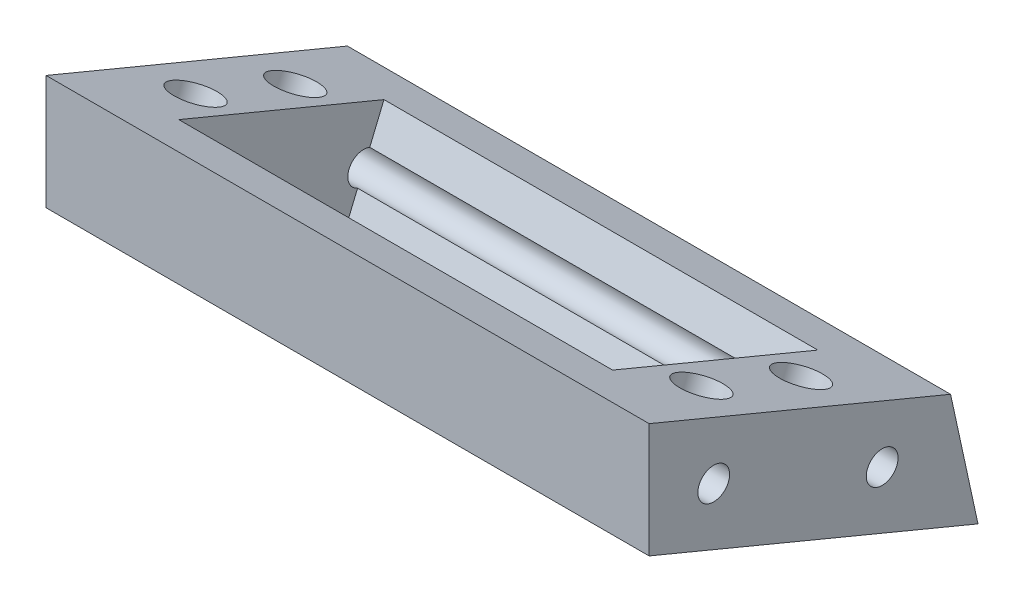
ISO-10303-21;
HEADER;
FILE_DESCRIPTION(('STEP AP214'),'2;1');
FILE_NAME('part.step','',(''),(''),'','','');
FILE_SCHEMA(('AUTOMOTIVE_DESIGN { 1 0 10303 214 1 1 1 1 }'));
ENDSEC;
DATA;
#1=APPLICATION_CONTEXT('core data for automotive mechanical design processes');
#2=APPLICATION_PROTOCOL_DEFINITION('international standard','automotive_design',2000,#1);
#3=PRODUCT_CONTEXT('',#1,'mechanical');
#4=PRODUCT('Part','Part','',(#3));
#5=PRODUCT_RELATED_PRODUCT_CATEGORY('part','',(#4));
#6=PRODUCT_DEFINITION_FORMATION('','',#4);
#7=PRODUCT_DEFINITION_CONTEXT('part definition',#1,'design');
#8=PRODUCT_DEFINITION('design','',#6,#7);
#9=PRODUCT_DEFINITION_SHAPE('','',#8);
#10=(LENGTH_UNIT() NAMED_UNIT(*) SI_UNIT(.MILLI.,.METRE.));
#11=(NAMED_UNIT(*) PLANE_ANGLE_UNIT() SI_UNIT($,.RADIAN.));
#12=(NAMED_UNIT(*) SI_UNIT($,.STERADIAN.) SOLID_ANGLE_UNIT());
#13=UNCERTAINTY_MEASURE_WITH_UNIT(LENGTH_MEASURE(1.E-05),#10,'distance_accuracy_value','');
#14=(GEOMETRIC_REPRESENTATION_CONTEXT(3) GLOBAL_UNCERTAINTY_ASSIGNED_CONTEXT((#13)) GLOBAL_UNIT_ASSIGNED_CONTEXT((#10,
#11,#12)) REPRESENTATION_CONTEXT('',''));
#15=CARTESIAN_POINT('',(0.,0.,0.));
#16=DIRECTION('',(0.,0.,1.));
#17=DIRECTION('',(1.,0.,0.));
#18=AXIS2_PLACEMENT_3D('',#15,#16,#17);
#19=CARTESIAN_POINT('',(8.,23.5590550923951,-6.90495453211055));
#20=DIRECTION('',(0.,-0.383750829564608,-0.923436679371399));
#21=DIRECTION('',(0.,0.923436679371399,-0.383750829564608));
#22=AXIS2_PLACEMENT_3D('',#19,#20,#21);
#23=PLANE('',#22);
#24=DIRECTION('',(0.,0.923436679371399,-0.383750829564608));
#25=VECTOR('',#24,1.);
#26=CARTESIAN_POINT('',(49.,23.5590550923951,-6.90495453211055));
#27=LINE('',#26,#25);
#28=CARTESIAN_POINT('',(49.,51.2621554735371,-18.4174794190488));
#29=VERTEX_POINT('',#28);
#30=CARTESIAN_POINT('',(49.,54.494184680609,-19.7606076671439));
#31=VERTEX_POINT('',#30);
#32=EDGE_CURVE('E132',#29,#31,#27,.T.);
#33=ORIENTED_EDGE('',*,*,#32,.T.);
#34=DIRECTION('',(-1.,0.,0.));
#35=VECTOR('',#34,1.);
#36=CARTESIAN_POINT('',(57.,54.494184680609,-19.7606076671439));
#37=LINE('',#36,#35);
#38=CARTESIAN_POINT('',(8.,54.494184680609,-19.7606076671439));
#39=VERTEX_POINT('',#38);
#40=EDGE_CURVE('E11',#31,#39,#37,.T.);
#41=ORIENTED_EDGE('',*,*,#40,.T.);
#42=DIRECTION('',(0.,0.923436679371399,-0.383750829564608));
#43=VECTOR('',#42,1.);
#44=CARTESIAN_POINT('',(8.,23.5590550923951,-6.90495453211055));
#45=LINE('',#44,#43);
#46=CARTESIAN_POINT('',(8.,51.2621554735371,-18.4174794190488));
#47=VERTEX_POINT('',#46);
#48=EDGE_CURVE('E61',#47,#39,#45,.T.);
#49=ORIENTED_EDGE('',*,*,#48,.F.);
#50=DIRECTION('',(-1.,0.,0.));
#51=VECTOR('',#50,1.);
#52=CARTESIAN_POINT('',(57.,51.2621554735371,-18.4174794190488));
#53=LINE('',#52,#51);
#54=EDGE_CURVE('E141',#29,#47,#53,.T.);
#55=ORIENTED_EDGE('',*,*,#54,.F.);
#56=EDGE_LOOP('',(#33,#41,#49,#55));
#57=FACE_BOUND('',#56,.T.);
#58=ADVANCED_FACE('F33',(#57),#23,.F.);
#59=CARTESIAN_POINT('',(57.,59.6160817232192,1.68494465772126));
#60=DIRECTION('',(0.,0.923436679371399,-0.383750829564608));
#61=DIRECTION('',(0.,0.383750829564608,0.923436679371399));
#62=AXIS2_PLACEMENT_3D('',#59,#60,#61);
#63=PLANE('',#62);
#64=CARTESIAN_POINT('',(52.3999999999999,53.3344099531859,-13.4309213504433));
#65=DIRECTION('',(0.,0.923436679371399,-0.383750829564608));
#66=DIRECTION('',(0.,0.383750829564608,0.923436679371399));
#67=AXIS2_PLACEMENT_3D('',#64,#65,#66);
#68=CIRCLE('',#67,2.20000000000001);
#69=CARTESIAN_POINT('',(52.3999999999999,54.1786617782281,-11.3993606558262));
#70=VERTEX_POINT('',#69);
#71=EDGE_CURVE('E449',#70,#70,#68,.T.);
#72=ORIENTED_EDGE('',*,*,#71,.T.);
#73=EDGE_LOOP('',(#72));
#74=FACE_BOUND('',#73,.T.);
#75=CARTESIAN_POINT('',(52.3999999999999,57.2486684147449,-4.01186722085499));
#76=DIRECTION('',(0.,0.923436679371399,-0.383750829564608));
#77=DIRECTION('',(0.,0.383750829564608,0.923436679371399));
#78=AXIS2_PLACEMENT_3D('',#75,#76,#77);
#79=CIRCLE('',#78,2.20000000000001);
#80=CARTESIAN_POINT('',(52.3999999999999,58.0929202397871,-1.9803065262379));
#81=VERTEX_POINT('',#80);
#82=EDGE_CURVE('E445',#81,#81,#79,.T.);
#83=ORIENTED_EDGE('',*,*,#82,.T.);
#84=EDGE_LOOP('',(#83));
#85=FACE_BOUND('',#84,.T.);
#86=CARTESIAN_POINT('',(4.59999999999987,53.3344099531859,-13.4309213504432));
#87=DIRECTION('',(0.,0.923436679371399,-0.383750829564608));
#88=DIRECTION('',(0.,0.383750829564608,0.923436679371399));
#89=AXIS2_PLACEMENT_3D('',#86,#87,#88);
#90=CIRCLE('',#89,2.20000000000001);
#91=CARTESIAN_POINT('',(4.59999999999987,54.1786617782281,-11.3993606558262));
#92=VERTEX_POINT('',#91);
#93=EDGE_CURVE('E439',#92,#92,#90,.T.);
#94=ORIENTED_EDGE('',*,*,#93,.T.);
#95=EDGE_LOOP('',(#94));
#96=FACE_BOUND('',#95,.T.);
#97=CARTESIAN_POINT('',(4.59999999999987,57.2486684147449,-4.01186722085498));
#98=DIRECTION('',(0.,0.923436679371399,-0.383750829564608));
#99=DIRECTION('',(0.,0.383750829564608,0.923436679371399));
#100=AXIS2_PLACEMENT_3D('',#97,#98,#99);
#101=CIRCLE('',#100,2.2);
#102=CARTESIAN_POINT('',(4.59999999999987,58.0929202397871,-1.9803065262379));
#103=VERTEX_POINT('',#102);
#104=EDGE_CURVE('E192',#103,#103,#101,.T.);
#105=ORIENTED_EDGE('',*,*,#104,.T.);
#106=EDGE_LOOP('',(#105));
#107=FACE_BOUND('',#106,.T.);
#108=DIRECTION('',(1.,0.,0.));
#109=VECTOR('',#108,1.);
#110=CARTESIAN_POINT('',(57.,59.3209228943938,0.974690847750589));
#111=LINE('',#110,#109);
#112=CARTESIAN_POINT('',(8.,59.3209228943938,0.974690847750589));
#113=VERTEX_POINT('',#112);
#114=CARTESIAN_POINT('',(49.,59.3209228943938,0.974690847750589));
#115=VERTEX_POINT('',#114);
#116=EDGE_CURVE('E148',#113,#115,#111,.T.);
#117=ORIENTED_EDGE('',*,*,#116,.T.);
#118=DIRECTION('',(0.,-0.383750829564608,-0.923436679371399));
#119=VECTOR('',#118,1.);
#120=CARTESIAN_POINT('',(49.,59.6160817232192,1.68494465772126));
#121=LINE('',#120,#119);
#122=EDGE_CURVE('E151',#115,#29,#121,.T.);
#123=ORIENTED_EDGE('',*,*,#122,.T.);
#124=ORIENTED_EDGE('',*,*,#54,.T.);
#125=DIRECTION('',(0.,0.383750829564608,0.923436679371399));
#126=VECTOR('',#125,1.);
#127=CARTESIAN_POINT('',(8.,59.6160817232192,1.68494465772126));
#128=LINE('',#127,#126);
#129=EDGE_CURVE('E144',#47,#113,#128,.T.);
#130=ORIENTED_EDGE('',*,*,#129,.T.);
#131=EDGE_LOOP('',(#117,#123,#124,#130));
#132=FACE_BOUND('',#131,.T.);
#133=DIRECTION('',(0.,-0.383750829564608,-0.923436679371399));
#134=VECTOR('',#133,1.);
#135=CARTESIAN_POINT('',(0.,59.6160817232192,1.68494465772126));
#136=LINE('',#135,#134);
#137=CARTESIAN_POINT('',(0.,59.6160817232192,1.68494465772126));
#138=VERTEX_POINT('',#137);
#139=CARTESIAN_POINT('',(0.,46.7007815458614,-29.3937162598213));
#140=VERTEX_POINT('',#139);
#141=EDGE_CURVE('E154',#138,#140,#136,.T.);
#142=ORIENTED_EDGE('',*,*,#141,.T.);
#143=DIRECTION('',(-1.,0.,0.));
#144=VECTOR('',#143,1.);
#145=CARTESIAN_POINT('',(57.,46.7007815458614,-29.3937162598213));
#146=LINE('',#145,#144);
#147=CARTESIAN_POINT('',(57.,46.7007815458614,-29.3937162598213));
#148=VERTEX_POINT('',#147);
#149=EDGE_CURVE('E119',#148,#140,#146,.T.);
#150=ORIENTED_EDGE('',*,*,#149,.F.);
#151=DIRECTION('',(0.,-0.383750829564608,-0.923436679371399));
#152=VECTOR('',#151,1.);
#153=CARTESIAN_POINT('',(57.,59.6160817232192,1.68494465772126));
#154=LINE('',#153,#152);
#155=CARTESIAN_POINT('',(57.,59.6160817232192,1.68494465772126));
#156=VERTEX_POINT('',#155);
#157=EDGE_CURVE('E155',#156,#148,#154,.T.);
#158=ORIENTED_EDGE('',*,*,#157,.F.);
#159=DIRECTION('',(-1.,0.,0.));
#160=VECTOR('',#159,1.);
#161=CARTESIAN_POINT('',(57.,59.6160817232192,1.68494465772126));
#162=LINE('',#161,#160);
#163=EDGE_CURVE('E165',#156,#138,#162,.T.);
#164=ORIENTED_EDGE('',*,*,#163,.T.);
#165=EDGE_LOOP('',(#142,#150,#158,#164));
#166=FACE_BOUND('',#165,.T.);
#167=ADVANCED_FACE('F35',(#74,#85,#96,#107,#132,#166),#63,.F.);
#168=CARTESIAN_POINT('',(57.,46.7007815458614,-29.3937162598213));
#169=DIRECTION('',(0.,-0.212644465606676,0.977129638915355));
#170=DIRECTION('',(0.,-0.977129638915355,-0.212644465606676));
#171=AXIS2_PLACEMENT_3D('',#168,#169,#170);
#172=PLANE('',#171);
#173=DIRECTION('',(0.,0.977129638915355,0.212644465606676));
#174=VECTOR('',#173,1.);
#175=CARTESIAN_POINT('',(0.,46.7007815458614,-29.3937162598213));
#176=LINE('',#175,#174);
#177=CARTESIAN_POINT('',(0.,58.6066173937724,-26.8027498203117));
#178=VERTEX_POINT('',#177);
#179=EDGE_CURVE('E168',#140,#178,#176,.T.);
#180=ORIENTED_EDGE('',*,*,#179,.T.);
#181=DIRECTION('',(-1.,0.,0.));
#182=VECTOR('',#181,1.);
#183=CARTESIAN_POINT('',(57.,58.6066173937724,-26.8027498203117));
#184=LINE('',#183,#182);
#185=CARTESIAN_POINT('',(57.,58.6066173937724,-26.8027498203117));
#186=VERTEX_POINT('',#185);
#187=EDGE_CURVE('E178',#186,#178,#184,.T.);
#188=ORIENTED_EDGE('',*,*,#187,.F.);
#189=DIRECTION('',(0.,0.977129638915355,0.212644465606676));
#190=VECTOR('',#189,1.);
#191=CARTESIAN_POINT('',(57.,46.7007815458614,-29.3937162598213));
#192=LINE('',#191,#190);
#193=EDGE_CURVE('E158',#148,#186,#192,.T.);
#194=ORIENTED_EDGE('',*,*,#193,.F.);
#195=ORIENTED_EDGE('',*,*,#149,.T.);
#196=EDGE_LOOP('',(#180,#188,#194,#195));
#197=FACE_BOUND('',#196,.T.);
#198=ADVANCED_FACE('F224',(#197),#172,.F.);
#199=CARTESIAN_POINT('',(57.,70.4451945615864,1.68494465772132));
#200=DIRECTION('',(0.,-0.923436679371399,0.383750829564608));
#201=DIRECTION('',(0.,-0.383750829564608,-0.923436679371399));
#202=AXIS2_PLACEMENT_3D('',#199,#200,#201);
#203=PLANE('',#202);
#204=CARTESIAN_POINT('',(52.3999999999999,62.5687767468999,-17.2684296460893));
#205=DIRECTION('',(0.,0.923436679371399,-0.383750829564608));
#206=DIRECTION('',(0.,0.383750829564608,0.923436679371399));
#207=AXIS2_PLACEMENT_3D('',#204,#205,#206);
#208=CIRCLE('',#207,2.20000000000001);
#209=CARTESIAN_POINT('',(52.3999999999999,63.4130285719421,-15.2368689514723));
#210=VERTEX_POINT('',#209);
#211=EDGE_CURVE('E427',#210,#210,#208,.T.);
#212=ORIENTED_EDGE('',*,*,#211,.F.);
#213=EDGE_LOOP('',(#212));
#214=FACE_BOUND('',#213,.T.);
#215=CARTESIAN_POINT('',(52.3999999999999,66.4830352084589,-7.84937551650107));
#216=DIRECTION('',(0.,0.923436679371399,-0.383750829564608));
#217=DIRECTION('',(0.,0.383750829564608,0.923436679371399));
#218=AXIS2_PLACEMENT_3D('',#215,#216,#217);
#219=CIRCLE('',#218,2.20000000000001);
#220=CARTESIAN_POINT('',(52.3999999999999,67.3272870335011,-5.81781482188399));
#221=VERTEX_POINT('',#220);
#222=EDGE_CURVE('E431',#221,#221,#219,.T.);
#223=ORIENTED_EDGE('',*,*,#222,.F.);
#224=EDGE_LOOP('',(#223));
#225=FACE_BOUND('',#224,.T.);
#226=CARTESIAN_POINT('',(4.59999999999987,62.5687767468999,-17.2684296460893));
#227=DIRECTION('',(0.,0.923436679371399,-0.383750829564608));
#228=DIRECTION('',(0.,0.383750829564608,0.923436679371399));
#229=AXIS2_PLACEMENT_3D('',#226,#227,#228);
#230=CIRCLE('',#229,2.20000000000001);
#231=CARTESIAN_POINT('',(4.59999999999987,63.4130285719421,-15.2368689514723));
#232=VERTEX_POINT('',#231);
#233=EDGE_CURVE('E435',#232,#232,#230,.T.);
#234=ORIENTED_EDGE('',*,*,#233,.F.);
#235=EDGE_LOOP('',(#234));
#236=FACE_BOUND('',#235,.T.);
#237=CARTESIAN_POINT('',(4.59999999999987,66.4830352084589,-7.84937551650107));
#238=DIRECTION('',(0.,0.923436679371399,-0.383750829564608));
#239=DIRECTION('',(0.,0.383750829564608,0.923436679371399));
#240=AXIS2_PLACEMENT_3D('',#237,#238,#239);
#241=CIRCLE('',#240,2.2);
#242=CARTESIAN_POINT('',(4.59999999999987,67.3272870335011,-5.81781482188399));
#243=VERTEX_POINT('',#242);
#244=EDGE_CURVE('E193',#243,#243,#241,.T.);
#245=ORIENTED_EDGE('',*,*,#244,.F.);
#246=EDGE_LOOP('',(#245));
#247=FACE_BOUND('',#246,.T.);
#248=DIRECTION('',(-1.,0.,0.));
#249=VECTOR('',#248,1.);
#250=CARTESIAN_POINT('',(8.,60.4965222672511,-22.2549877146949));
#251=LINE('',#250,#249);
#252=CARTESIAN_POINT('',(49.,60.496522267251,-22.2549877146949));
#253=VERTEX_POINT('',#252);
#254=CARTESIAN_POINT('',(8.,60.4965222672511,-22.2549877146949));
#255=VERTEX_POINT('',#254);
#256=EDGE_CURVE('E130',#253,#255,#251,.T.);
#257=ORIENTED_EDGE('',*,*,#256,.F.);
#258=DIRECTION('',(0.,-0.383750829564608,-0.923436679371398));
#259=VECTOR('',#258,1.);
#260=CARTESIAN_POINT('',(49.,68.5552896881078,-2.8628174478955));
#261=LINE('',#260,#259);
#262=CARTESIAN_POINT('',(49.,68.5552896881078,-2.8628174478955));
#263=VERTEX_POINT('',#262);
#264=EDGE_CURVE('E274',#263,#253,#261,.T.);
#265=ORIENTED_EDGE('',*,*,#264,.F.);
#266=DIRECTION('',(1.,0.,0.));
#267=VECTOR('',#266,1.);
#268=CARTESIAN_POINT('',(8.,68.5552896881078,-2.8628174478955));
#269=LINE('',#268,#267);
#270=CARTESIAN_POINT('',(8.,68.5552896881078,-2.8628174478955));
#271=VERTEX_POINT('',#270);
#272=EDGE_CURVE('E280',#271,#263,#269,.T.);
#273=ORIENTED_EDGE('',*,*,#272,.F.);
#274=DIRECTION('',(0.,0.383750829564608,0.923436679371398));
#275=VECTOR('',#274,1.);
#276=CARTESIAN_POINT('',(8.,68.5552896881078,-2.8628174478955));
#277=LINE('',#276,#275);
#278=EDGE_CURVE('E278',#255,#271,#277,.T.);
#279=ORIENTED_EDGE('',*,*,#278,.F.);
#280=EDGE_LOOP('',(#257,#265,#273,#279));
#281=FACE_BOUND('',#280,.T.);
#282=DIRECTION('',(0.,0.383750829564608,0.923436679371399));
#283=VECTOR('',#282,1.);
#284=CARTESIAN_POINT('',(0.,70.4451945615864,1.68494465772132));
#285=LINE('',#284,#283);
#286=CARTESIAN_POINT('',(0.,70.4451945615864,1.68494465772132));
#287=VERTEX_POINT('',#286);
#288=EDGE_CURVE('E170',#178,#287,#285,.T.);
#289=ORIENTED_EDGE('',*,*,#288,.T.);
#290=DIRECTION('',(-1.,0.,0.));
#291=VECTOR('',#290,1.);
#292=CARTESIAN_POINT('',(57.,70.4451945615864,1.68494465772132));
#293=LINE('',#292,#291);
#294=CARTESIAN_POINT('',(57.,70.4451945615864,1.68494465772132));
#295=VERTEX_POINT('',#294);
#296=EDGE_CURVE('E175',#295,#287,#293,.T.);
#297=ORIENTED_EDGE('',*,*,#296,.F.);
#298=DIRECTION('',(0.,0.383750829564608,0.923436679371399));
#299=VECTOR('',#298,1.);
#300=CARTESIAN_POINT('',(57.,70.4451945615864,1.68494465772132));
#301=LINE('',#300,#299);
#302=EDGE_CURVE('E161',#186,#295,#301,.T.);
#303=ORIENTED_EDGE('',*,*,#302,.F.);
#304=ORIENTED_EDGE('',*,*,#187,.T.);
#305=EDGE_LOOP('',(#289,#297,#303,#304));
#306=FACE_BOUND('',#305,.T.);
#307=ADVANCED_FACE('F288',(#214,#225,#236,#247,#281,#306),#203,.F.);
#308=CARTESIAN_POINT('',(57.,59.6160817232192,1.68494465772126));
#309=DIRECTION('',(0.,0.,-1.));
#310=DIRECTION('',(0.,1.,0.));
#311=AXIS2_PLACEMENT_3D('',#308,#309,#310);
#312=PLANE('',#311);
#313=DIRECTION('',(0.,-1.,0.));
#314=VECTOR('',#313,1.);
#315=CARTESIAN_POINT('',(0.,59.6160817232192,1.68494465772126));
#316=LINE('',#315,#314);
#317=EDGE_CURVE('E159',#287,#138,#316,.T.);
#318=ORIENTED_EDGE('',*,*,#317,.T.);
#319=ORIENTED_EDGE('',*,*,#163,.F.);
#320=DIRECTION('',(0.,-1.,0.));
#321=VECTOR('',#320,1.);
#322=CARTESIAN_POINT('',(57.,59.6160817232192,1.68494465772126));
#323=LINE('',#322,#321);
#324=EDGE_CURVE('E163',#295,#156,#323,.T.);
#325=ORIENTED_EDGE('',*,*,#324,.F.);
#326=ORIENTED_EDGE('',*,*,#296,.T.);
#327=EDGE_LOOP('',(#318,#319,#325,#326));
#328=FACE_BOUND('',#327,.T.);
#329=ADVANCED_FACE('F309',(#328),#312,.F.);
#330=CARTESIAN_POINT('',(57.,0.,0.));
#331=DIRECTION('',(1.,0.,0.));
#332=DIRECTION('',(0.,0.,-1.));
#333=AXIS2_PLACEMENT_3D('',#330,#331,#332);
#334=PLANE('',#333);
#335=CARTESIAN_POINT('',(57.,62.4937532612766,-4.41967419934431));
#336=DIRECTION('',(-1.,0.,0.));
#337=DIRECTION('',(0.,0.,1.));
#338=AXIS2_PLACEMENT_3D('',#335,#336,#337);
#339=CIRCLE('',#338,1.5);
#340=CARTESIAN_POINT('',(57.,62.4937532612766,-2.91967419934431));
#341=VERTEX_POINT('',#340);
#342=EDGE_CURVE('E186',#341,#341,#339,.T.);
#343=ORIENTED_EDGE('',*,*,#342,.T.);
#344=EDGE_LOOP('',(#343));
#345=FACE_BOUND('',#344,.T.);
#346=CARTESIAN_POINT('',(57.,55.878708994698,-20.3377492647581));
#347=DIRECTION('',(-1.,0.,0.));
#348=DIRECTION('',(0.,0.,1.));
#349=AXIS2_PLACEMENT_3D('',#346,#347,#348);
#350=CIRCLE('',#349,1.5);
#351=CARTESIAN_POINT('',(57.,55.878708994698,-18.8377492647581));
#352=VERTEX_POINT('',#351);
#353=EDGE_CURVE('E126',#352,#352,#350,.T.);
#354=ORIENTED_EDGE('',*,*,#353,.T.);
#355=EDGE_LOOP('',(#354));
#356=FACE_BOUND('',#355,.T.);
#357=ORIENTED_EDGE('',*,*,#157,.T.);
#358=ORIENTED_EDGE('',*,*,#193,.T.);
#359=ORIENTED_EDGE('',*,*,#302,.T.);
#360=ORIENTED_EDGE('',*,*,#324,.T.);
#361=EDGE_LOOP('',(#357,#358,#359,#360));
#362=FACE_BOUND('',#361,.T.);
#363=ADVANCED_FACE('F305',(#345,#356,#362),#334,.T.);
#364=CARTESIAN_POINT('',(0.,0.,0.));
#365=DIRECTION('',(1.,0.,0.));
#366=DIRECTION('',(0.,0.,-1.));
#367=AXIS2_PLACEMENT_3D('',#364,#365,#366);
#368=PLANE('',#367);
#369=CARTESIAN_POINT('',(0.,62.4937532612766,-4.41967419934431));
#370=DIRECTION('',(-1.,0.,0.));
#371=DIRECTION('',(0.,0.,1.));
#372=AXIS2_PLACEMENT_3D('',#369,#370,#371);
#373=CIRCLE('',#372,1.5);
#374=CARTESIAN_POINT('',(0.,62.4937532612766,-2.91967419934431));
#375=VERTEX_POINT('',#374);
#376=EDGE_CURVE('E258',#375,#375,#373,.T.);
#377=ORIENTED_EDGE('',*,*,#376,.F.);
#378=EDGE_LOOP('',(#377));
#379=FACE_BOUND('',#378,.T.);
#380=CARTESIAN_POINT('',(0.,55.878708994698,-20.3377492647581));
#381=DIRECTION('',(-1.,0.,0.));
#382=DIRECTION('',(0.,0.,1.));
#383=AXIS2_PLACEMENT_3D('',#380,#381,#382);
#384=CIRCLE('',#383,1.5);
#385=CARTESIAN_POINT('',(0.,55.878708994698,-18.8377492647581));
#386=VERTEX_POINT('',#385);
#387=EDGE_CURVE('E268',#386,#386,#384,.T.);
#388=ORIENTED_EDGE('',*,*,#387,.F.);
#389=EDGE_LOOP('',(#388));
#390=FACE_BOUND('',#389,.T.);
#391=ORIENTED_EDGE('',*,*,#141,.F.);
#392=ORIENTED_EDGE('',*,*,#317,.F.);
#393=ORIENTED_EDGE('',*,*,#288,.F.);
#394=ORIENTED_EDGE('',*,*,#179,.F.);
#395=EDGE_LOOP('',(#391,#392,#393,#394));
#396=FACE_BOUND('',#395,.T.);
#397=ADVANCED_FACE('F299',(#379,#390,#396),#368,.F.);
#398=CARTESIAN_POINT('',(49.,31.6178225132519,12.4872157346888));
#399=DIRECTION('',(1.,0.,0.));
#400=DIRECTION('',(0.,0.,-1.));
#401=AXIS2_PLACEMENT_3D('',#398,#399,#400);
#402=PLANE('',#401);
#403=CARTESIAN_POINT('',(49.,62.4937532612766,-4.41967419934431));
#404=DIRECTION('',(1.,0.,0.));
#405=DIRECTION('',(0.,0.,-1.));
#406=AXIS2_PLACEMENT_3D('',#403,#404,#405);
#407=CIRCLE('',#406,1.5);
#408=CARTESIAN_POINT('',(49.,62.4937532612766,-5.91967419934431));
#409=VERTEX_POINT('',#408);
#410=EDGE_CURVE('E185',#409,#409,#407,.T.);
#411=ORIENTED_EDGE('',*,*,#410,.T.);
#412=EDGE_LOOP('',(#411));
#413=FACE_BOUND('',#412,.T.);
#414=CARTESIAN_POINT('',(49.,57.2644930601791,-20.9118594665997));
#415=VERTEX_POINT('',#414);
#416=EDGE_CURVE('E136',#415,#253,#27,.T.);
#417=ORIENTED_EDGE('',*,*,#416,.F.);
#418=CARTESIAN_POINT('',(49.,55.878708994698,-20.3377492647581));
#419=DIRECTION('',(1.,0.,0.));
#420=DIRECTION('',(0.,0.,-1.));
#421=AXIS2_PLACEMENT_3D('',#418,#419,#420);
#422=CIRCLE('',#421,1.5);
#423=EDGE_CURVE('E54',#415,#31,#422,.T.);
#424=ORIENTED_EDGE('',*,*,#423,.T.);
#425=ORIENTED_EDGE('',*,*,#32,.F.);
#426=ORIENTED_EDGE('',*,*,#122,.F.);
#427=DIRECTION('',(0.,0.923436679371399,-0.383750829564608));
#428=VECTOR('',#427,1.);
#429=CARTESIAN_POINT('',(49.,31.6178225132519,12.4872157346888));
#430=LINE('',#429,#428);
#431=EDGE_CURVE('E145',#115,#263,#430,.T.);
#432=ORIENTED_EDGE('',*,*,#431,.T.);
#433=ORIENTED_EDGE('',*,*,#264,.T.);
#434=EDGE_LOOP('',(#417,#424,#425,#426,#432,#433));
#435=FACE_BOUND('',#434,.T.);
#436=ADVANCED_FACE('F242',(#413,#435),#402,.F.);
#437=CARTESIAN_POINT('',(8.,31.6178225132519,12.4872157346888));
#438=DIRECTION('',(0.,0.383750829564608,0.923436679371399));
#439=DIRECTION('',(0.,-0.923436679371399,0.383750829564608));
#440=AXIS2_PLACEMENT_3D('',#437,#438,#439);
#441=PLANE('',#440);
#442=DIRECTION('',(0.,0.923436679371399,-0.383750829564608));
#443=VECTOR('',#442,1.);
#444=CARTESIAN_POINT('',(8.,31.6178225132519,12.4872157346888));
#445=LINE('',#444,#443);
#446=EDGE_CURVE('E134',#113,#271,#445,.T.);
#447=ORIENTED_EDGE('',*,*,#446,.T.);
#448=ORIENTED_EDGE('',*,*,#272,.T.);
#449=ORIENTED_EDGE('',*,*,#431,.F.);
#450=ORIENTED_EDGE('',*,*,#116,.F.);
#451=EDGE_LOOP('',(#447,#448,#449,#450));
#452=FACE_BOUND('',#451,.T.);
#453=ADVANCED_FACE('F236',(#452),#441,.F.);
#454=CARTESIAN_POINT('',(8.,31.6178225132519,12.4872157346888));
#455=DIRECTION('',(-1.,0.,0.));
#456=DIRECTION('',(0.,0.,1.));
#457=AXIS2_PLACEMENT_3D('',#454,#455,#456);
#458=PLANE('',#457);
#459=CARTESIAN_POINT('',(8.,62.4937532612766,-4.41967419934431));
#460=DIRECTION('',(-1.,0.,0.));
#461=DIRECTION('',(0.,0.,1.));
#462=AXIS2_PLACEMENT_3D('',#459,#460,#461);
#463=CIRCLE('',#462,1.5);
#464=CARTESIAN_POINT('',(8.,62.4937532612766,-2.91967419934431));
#465=VERTEX_POINT('',#464);
#466=EDGE_CURVE('E183',#465,#465,#463,.T.);
#467=ORIENTED_EDGE('',*,*,#466,.T.);
#468=EDGE_LOOP('',(#467));
#469=FACE_BOUND('',#468,.T.);
#470=ORIENTED_EDGE('',*,*,#48,.T.);
#471=CARTESIAN_POINT('',(8.,55.878708994698,-20.3377492647581));
#472=DIRECTION('',(-1.,0.,0.));
#473=DIRECTION('',(0.,0.,1.));
#474=AXIS2_PLACEMENT_3D('',#471,#472,#473);
#475=CIRCLE('',#474,1.5);
#476=CARTESIAN_POINT('',(7.99999999999999,57.2644930601791,-20.9118594665997));
#477=VERTEX_POINT('',#476);
#478=EDGE_CURVE('E115',#39,#477,#475,.T.);
#479=ORIENTED_EDGE('',*,*,#478,.T.);
#480=EDGE_CURVE('E124',#477,#255,#45,.T.);
#481=ORIENTED_EDGE('',*,*,#480,.T.);
#482=ORIENTED_EDGE('',*,*,#278,.T.);
#483=ORIENTED_EDGE('',*,*,#446,.F.);
#484=ORIENTED_EDGE('',*,*,#129,.F.);
#485=EDGE_LOOP('',(#470,#479,#481,#482,#483,#484));
#486=FACE_BOUND('',#485,.T.);
#487=ADVANCED_FACE('F122',(#469,#486),#458,.F.);
#488=ORIENTED_EDGE('',*,*,#480,.F.);
#489=DIRECTION('',(-1.,0.,0.));
#490=VECTOR('',#489,1.);
#491=CARTESIAN_POINT('',(57.,57.2644930601791,-20.9118594665997));
#492=LINE('',#491,#490);
#493=EDGE_CURVE('E46',#477,#415,#492,.F.);
#494=ORIENTED_EDGE('',*,*,#493,.T.);
#495=ORIENTED_EDGE('',*,*,#416,.T.);
#496=ORIENTED_EDGE('',*,*,#256,.T.);
#497=EDGE_LOOP('',(#488,#494,#495,#496));
#498=FACE_BOUND('',#497,.T.);
#499=ADVANCED_FACE('F128',(#498),#23,.F.);
#500=CARTESIAN_POINT('',(57.,55.878708994698,-20.3377492647581));
#501=DIRECTION('',(-1.,0.,0.));
#502=DIRECTION('',(0.,0.,1.));
#503=AXIS2_PLACEMENT_3D('',#500,#501,#502);
#504=CYLINDRICAL_SURFACE('',#503,1.5);
#505=ORIENTED_EDGE('',*,*,#387,.T.);
#506=EDGE_LOOP('',(#505));
#507=FACE_BOUND('',#506,.T.);
#508=ORIENTED_EDGE('',*,*,#353,.F.);
#509=EDGE_LOOP('',(#508));
#510=FACE_BOUND('',#509,.T.);
#511=ORIENTED_EDGE('',*,*,#423,.F.);
#512=ORIENTED_EDGE('',*,*,#493,.F.);
#513=ORIENTED_EDGE('',*,*,#478,.F.);
#514=ORIENTED_EDGE('',*,*,#40,.F.);
#515=EDGE_LOOP('',(#511,#512,#513,#514));
#516=FACE_BOUND('',#515,.T.);
#517=ADVANCED_FACE('F114',(#507,#510,#516),#504,.F.);
#518=CARTESIAN_POINT('',(57.,62.4937532612766,-4.41967419934431));
#519=DIRECTION('',(-1.,0.,0.));
#520=DIRECTION('',(0.,0.,1.));
#521=AXIS2_PLACEMENT_3D('',#518,#519,#520);
#522=CYLINDRICAL_SURFACE('',#521,1.5);
#523=CARTESIAN_POINT('',(4.59999999999987,61.4265086911449,-3.36563955687556));
#524=CARTESIAN_POINT('',(4.53619343908704,61.4265071707837,-3.36563953880229));
#525=CARTESIAN_POINT('',(4.47237420723145,61.4243915443062,-3.36776993277666));
#526=CARTESIAN_POINT('',(4.34526454964432,61.4160574929806,-3.37631138078245));
#527=CARTESIAN_POINT('',(4.28197446722894,61.4098365865177,-3.38272502403817));
#528=CARTESIAN_POINT('',(4.15631409259167,61.3936503625794,-3.39991277179482));
#529=CARTESIAN_POINT('',(4.09394641928176,61.3836759523683,-3.41069746995512));
#530=CARTESIAN_POINT('',(3.97073728472832,61.3605669793758,-3.43672511139529));
#531=CARTESIAN_POINT('',(3.90989648877438,61.3474310645873,-3.45196996264813));
#532=CARTESIAN_POINT('',(3.73889374744615,61.3064034336583,-3.50207594967348));
#533=CARTESIAN_POINT('',(3.63103677807546,61.2754979663595,-3.54256482812062));
#534=CARTESIAN_POINT('',(3.42446153859409,61.2106616691896,-3.640503462112));
#535=CARTESIAN_POINT('',(3.32572948547127,61.1767355593453,-3.69792706937684));
#536=CARTESIAN_POINT('',(3.15981157530447,61.1191418013168,-3.81651205490131));
#537=CARTESIAN_POINT('',(3.0903999600046,61.0948339521412,-3.87423429903654));
#538=CARTESIAN_POINT('',(2.96040518404882,61.0519150415666,-4.00069888060496));
#539=CARTESIAN_POINT('',(2.89980917567211,61.0332956454468,-4.06942486796945));
#540=CARTESIAN_POINT('',(2.79792639566513,61.0078707263567,-4.20492576642256));
#541=CARTESIAN_POINT('',(2.75510138337331,60.9996575575673,-4.270273582379));
#542=CARTESIAN_POINT('',(2.67767195903158,60.9922753652011,-4.40616742046927));
#543=CARTESIAN_POINT('',(2.64306328058107,60.9931016372777,-4.47671071976067));
#544=CARTESIAN_POINT('',(2.5821969459681,61.0055224531588,-4.62067222790765));
#545=CARTESIAN_POINT('',(2.55596427453867,61.0171488166064,-4.6940983176458));
#546=CARTESIAN_POINT('',(2.51141171154841,61.0520537445078,-4.84059315360647));
#547=CARTESIAN_POINT('',(2.49309369946833,61.0753350738162,-4.91366181088176));
#548=CARTESIAN_POINT('',(2.46381048028271,61.1320442609081,-5.05303114993637));
#549=CARTESIAN_POINT('',(2.45253509205174,61.1649326591901,-5.11948836783624));
#550=CARTESIAN_POINT('',(2.4345616097242,61.2405013867828,-5.24724397965091));
#551=CARTESIAN_POINT('',(2.42786437602996,61.2831835546882,-5.30854140195475));
#552=CARTESIAN_POINT('',(2.41733277130163,61.3799189026685,-5.42742567986369));
#553=CARTESIAN_POINT('',(2.41367530124355,61.4344668593548,-5.484625395994));
#554=CARTESIAN_POINT('',(2.40843715450662,61.551923719309,-5.58979234867346));
#555=CARTESIAN_POINT('',(2.40685698051476,61.6148346422855,-5.63775734810817));
#556=CARTESIAN_POINT('',(2.40475428799378,61.7509757730321,-5.72550055234328));
#557=CARTESIAN_POINT('',(2.40429273480449,61.8245775793022,-5.76470501801089));
#558=CARTESIAN_POINT('',(2.40416451902671,61.9772589513001,-5.83039857133468));
#559=CARTESIAN_POINT('',(2.40449796625743,62.0563392723502,-5.85688590167268));
#560=CARTESIAN_POINT('',(2.40629499487091,62.218792951429,-5.89665602031435));
#561=CARTESIAN_POINT('',(2.40777258670972,62.3022074834839,-5.90977040569137));
#562=CARTESIAN_POINT('',(2.41296224584158,62.4700059519566,-5.9218428352861));
#563=CARTESIAN_POINT('',(2.41667454376511,62.5543899875489,-5.92079941812323));
#564=CARTESIAN_POINT('',(2.42798595591006,62.7208323493767,-5.90472047270775));
#565=CARTESIAN_POINT('',(2.43555124496794,62.8029044630232,-5.88980579344033));
#566=CARTESIAN_POINT('',(2.45655266592693,62.9627480551214,-5.84686703011278));
#567=CARTESIAN_POINT('',(2.4699851696173,63.0405221579782,-5.81885104697712));
#568=CARTESIAN_POINT('',(2.50375759928256,63.1851600714666,-5.75306734599553));
#569=CARTESIAN_POINT('',(2.52370171982155,63.2523810172679,-5.71588292805543));
#570=CARTESIAN_POINT('',(2.57179569865024,63.3783540596535,-5.63340569335334));
#571=CARTESIAN_POINT('',(2.59994190068005,63.4371099123385,-5.58811649294185));
#572=CARTESIAN_POINT('',(2.66305999865205,63.5418007002078,-5.4949618695701));
#573=CARTESIAN_POINT('',(2.69757434786481,63.5882611143842,-5.44737284896631));
#574=CARTESIAN_POINT('',(2.77397778617724,63.6720337418272,-5.3501464291426));
#575=CARTESIAN_POINT('',(2.81586871921281,63.7093436621381,-5.30050852013971));
#576=CARTESIAN_POINT('',(2.90908828511486,63.7772820690371,-5.19848361457283));
#577=CARTESIAN_POINT('',(2.96084073745082,63.8073536573347,-5.14611675097047));
#578=CARTESIAN_POINT('',(3.07077022368388,63.8588670429054,-5.0439686196913));
#579=CARTESIAN_POINT('',(3.12895246067379,63.8803017849614,-4.99418949466271));
#580=CARTESIAN_POINT('',(3.28054877782109,63.9247944859402,-4.87560155554599));
#581=CARTESIAN_POINT('',(3.3772804669708,63.9435223364959,-4.80938794998305));
#582=CARTESIAN_POINT('',(3.58009489281493,63.9703856575432,-4.69039550604833));
#583=CARTESIAN_POINT('',(3.68619516512446,63.9785007950204,-4.63764261231113));
#584=CARTESIAN_POINT('',(3.906958845852,63.9889380423384,-4.54812207167341));
#585=CARTESIAN_POINT('',(4.02171687930285,63.991182188321,-4.51157485865705));
#586=CARTESIAN_POINT('',(4.19706394469594,63.9929108278978,-4.47155712006991));
#587=CARTESIAN_POINT('',(4.25603429269678,63.9932142273882,-4.46068583893347));
#588=CARTESIAN_POINT('',(4.3746873333593,63.9935790679577,-4.44407550777476));
#589=CARTESIAN_POINT('',(4.43436972611465,63.9936406075316,-4.43833436929546));
#590=CARTESIAN_POINT('',(4.55427942426147,63.9937047731088,-4.43210776192171));
#591=CARTESIAN_POINT('',(4.61450797344387,63.993707129044,-4.43164639098295));
#592=CARTESIAN_POINT('',(4.73477034571839,63.9936654560333,-4.43604999547752));
#593=CARTESIAN_POINT('',(4.79480416425337,63.9936214260095,-4.44091509467362));
#594=CARTESIAN_POINT('',(4.91426371864402,63.9933353429042,-4.45586343435986));
#595=CARTESIAN_POINT('',(4.97368896534577,63.9930931415223,-4.46595058066502));
#596=CARTESIAN_POINT('',(5.09147553213365,63.992102880742,-4.49111639244245));
#597=CARTESIAN_POINT('',(5.14983642867686,63.9913546242903,-4.50619700115607));
#598=CARTESIAN_POINT('',(5.31940468668875,63.9878009705479,-4.55748210373533));
#599=CARTESIAN_POINT('',(5.42867676244282,63.9837225261765,-4.60021231974716));
#600=CARTESIAN_POINT('',(5.63944049093669,63.9680598265117,-4.70072984905899));
#601=CARTESIAN_POINT('',(5.74093363649621,63.9564770154012,-4.75851426396439));
#602=CARTESIAN_POINT('',(5.91977907293372,63.9235815671688,-4.87659564492852));
#603=CARTESIAN_POINT('',(5.99849090215668,63.9039401788474,-4.9352884317625));
#604=CARTESIAN_POINT('',(6.14675290144561,63.8525047497388,-5.0586075688445));
#605=CARTESIAN_POINT('',(6.21631842861184,63.8207314386295,-5.12322365568433));
#606=CARTESIAN_POINT('',(6.33199936681299,63.74980268407,-5.24196366733978));
#607=CARTESIAN_POINT('',(6.38005447227101,63.7132253728087,-5.29572776702029));
#608=CARTESIAN_POINT('',(6.46781152268112,63.6294858873527,-5.4018484594553));
#609=CARTESIAN_POINT('',(6.50751897574605,63.5823307355721,-5.45420596031771));
#610=CARTESIAN_POINT('',(6.57816890873758,63.4773037983728,-5.55453994771204));
#611=CARTESIAN_POINT('',(6.60906981968427,63.4193832527922,-5.60249495532482));
#612=CARTESIAN_POINT('',(6.66208425735363,63.2942538170675,-5.69051872884032));
#613=CARTESIAN_POINT('',(6.68419730275382,63.2270444184329,-5.7305870627193));
#614=CARTESIAN_POINT('',(6.7193614515008,63.0909426786968,-5.79760049554375));
#615=CARTESIAN_POINT('',(6.73297474494036,63.0225689680177,-5.82531301466256));
#616=CARTESIAN_POINT('',(6.75501331379355,62.8817376265997,-5.87051532070895));
#617=CARTESIAN_POINT('',(6.76343772021009,62.8092793140181,-5.88800339529596));
#618=CARTESIAN_POINT('',(6.77681962152727,62.6593337667679,-5.91251796924898));
#619=CARTESIAN_POINT('',(6.78162619576285,62.5817610858802,-5.91910156223054));
#620=CARTESIAN_POINT('',(6.78870165362283,62.4264167542802,-5.92017561878453));
#621=CARTESIAN_POINT('',(6.79096989134739,62.3486450579706,-5.91466300543751));
#622=CARTESIAN_POINT('',(6.79418756155445,62.1901685701017,-5.89094512897025));
#623=CARTESIAN_POINT('',(6.7950482002437,62.1095738645653,-5.87198683065974));
#624=CARTESIAN_POINT('',(6.79589870231118,61.9525861597271,-5.82108437498739));
#625=CARTESIAN_POINT('',(6.79588844042814,61.8761937664233,-5.7891383502639));
#626=CARTESIAN_POINT('',(6.7949789593274,61.7282991977755,-5.71240386120429));
#627=CARTESIAN_POINT('',(6.79406283149835,61.6569177083335,-5.66738263348521));
#628=CARTESIAN_POINT('',(6.79052985535272,61.5227116570926,-5.56603764898818));
#629=CARTESIAN_POINT('',(6.7879127548998,61.4598883655513,-5.50971221743614));
#630=CARTESIAN_POINT('',(6.77952263136588,61.344860553053,-5.38768607413633));
#631=CARTESIAN_POINT('',(6.7737616810264,61.2926164524104,-5.32202193282258));
#632=CARTESIAN_POINT('',(6.75716732956888,61.2000253833752,-5.18335473782392));
#633=CARTESIAN_POINT('',(6.74633620016209,61.1596730999941,-5.11035498237836));
#634=CARTESIAN_POINT('',(6.71815472358736,61.093377705047,-4.96299661389741));
#635=CARTESIAN_POINT('',(6.70109589973434,61.0669026533894,-4.88882244511697));
#636=CARTESIAN_POINT('',(6.65894282772465,61.0261907029099,-4.7394317983434));
#637=CARTESIAN_POINT('',(6.63385362391424,61.0119461420394,-4.66421600295769));
#638=CARTESIAN_POINT('',(6.57675996363216,60.9955322699428,-4.52075352114885));
#639=CARTESIAN_POINT('',(6.54530089736872,60.9926484392007,-4.45236890842587));
#640=CARTESIAN_POINT('',(6.474731238718,60.9956082339314,-4.31989489877842));
#641=CARTESIAN_POINT('',(6.43561922776267,61.0014534787807,-4.25580630113501));
#642=CARTESIAN_POINT('',(6.34901980817266,61.0202699742603,-4.13172922561319));
#643=CARTESIAN_POINT('',(6.30130905839144,61.0334579824172,-4.07193119702144));
#644=CARTESIAN_POINT('',(6.19935227193297,61.0648278305211,-3.95970208795605));
#645=CARTESIAN_POINT('',(6.14510198184344,61.0830129305943,-3.90727585074548));
#646=CARTESIAN_POINT('',(6.00406715250356,61.1314452432197,-3.7871627030972));
#647=CARTESIAN_POINT('',(5.9140161982587,61.1633334247815,-3.72395917628593));
#648=CARTESIAN_POINT('',(5.72441584972422,61.227073146188,-3.61369953846724));
#649=CARTESIAN_POINT('',(5.62484461794207,61.2589244235454,-3.56668174732751));
#650=CARTESIAN_POINT('',(5.41651922210322,61.3178243662527,-3.48710000744665));
#651=CARTESIAN_POINT('',(5.30763434111205,61.3447787014283,-3.45480484182585));
#652=CARTESIAN_POINT('',(5.14057818324666,61.3775593165682,-3.41748871761372));
#653=CARTESIAN_POINT('',(5.0843228226055,61.3872058699013,-3.40690890976795));
#654=CARTESIAN_POINT('',(4.97083623848738,61.4035351115741,-3.38934841025591));
#655=CARTESIAN_POINT('',(4.9136054991889,61.410219228387,-3.38236598368465));
#656=CARTESIAN_POINT('',(4.81362122932009,61.4189716113106,-3.37331305977877));
#657=CARTESIAN_POINT('',(4.77100290619698,61.421790383483,-3.37043496378155));
#658=CARTESIAN_POINT('',(4.68559163805934,61.4255595640166,-3.3665980841065));
#659=CARTESIAN_POINT('',(4.64279866944919,61.4265097109371,-3.36563956899832));
#660=CARTESIAN_POINT('',(4.59999999999987,61.4265086911449,-3.36563955687556));
#661=B_SPLINE_CURVE_WITH_KNOTS('',3,(#523,#524,#525,#526,#527,#528,#529,#530,#531,#532,#533,
#534,#535,#536,#537,#538,#539,#540,#541,#542,#543,#544,#545,#546,#547,#548,#549,#550,#551,#552,
#553,#554,#555,#556,#557,#558,#559,#560,#561,#562,#563,#564,#565,#566,#567,#568,#569,#570,#571,
#572,#573,#574,#575,#576,#577,#578,#579,#580,#581,#582,#583,#584,#585,#586,#587,#588,#589,#590,
#591,#592,#593,#594,#595,#596,#597,#598,#599,#600,#601,#602,#603,#604,#605,#606,#607,#608,#609,
#610,#611,#612,#613,#614,#615,#616,#617,#618,#619,#620,#621,#622,#623,#624,#625,#626,#627,#628,
#629,#630,#631,#632,#633,#634,#635,#636,#637,#638,#639,#640,#641,#642,#643,#644,#645,#646,#647,
#648,#649,#650,#651,#652,#653,#654,#655,#656,#657,#658,#659,#660),.UNSPECIFIED.,.T.,.F.,(4,2,2,
2,2,2,2,2,2,2,2,2,2,2,2,2,2,2,2,2,2,2,2,2,2,2,2,2,2,2,2,2,2,2,2,2,2,2,2,2,2,2,2,2,2,2,2,2,2,2,2,
2,2,2,2,2,2,2,2,2,2,2,2,2,2,2,2,2,4),(0.,0.19137166347599,0.382859115967199,0.574813458061961,
0.766850035124023,1.12307232573161,1.47874744124258,1.75818908618443,2.03721930762644,
2.271885762638,2.50643009728554,2.74166765459478,2.97696104270716,3.20098342369457,
3.4250478950976,3.66138512158851,3.89777952904284,4.14679365399454,4.39584217908287,
4.6479895758637,4.90016299971424,5.15015981852076,5.40000226086469,5.63684393162336,
5.87358018603226,6.09736779662976,6.32121142737463,6.55891811865149,6.79681859464941,
7.15103228277911,7.50592362340078,7.8655043687425,8.0452136104698,8.22484966003395,
8.40530528057446,8.58576509416609,8.76636007757841,8.94702542357182,9.29765355791542,
9.6482142354231,9.94749161735291,10.2462598994193,10.487825440129,10.7292310825052,
10.9717580263571,11.2142982518857,11.4383540068663,11.6624472748812,11.8954374062362,
12.1284868103046,12.3757385788057,12.6230259094857,12.8750178572356,13.1270471664447,
13.3781153959547,13.6290712409911,13.86953390622,14.1098458184026,14.3347766135099,
14.5597491418907,14.7917446776709,15.0238919292591,15.3656580727896,15.7082278738413,
16.0568233149381,16.2308129395548,16.404718575661,16.5330644190881,16.6614282182007),.UNSPECIFIED.);
#662=CARTESIAN_POINT('',(4.59999999999987,61.4265086911449,-3.36563955687556));
#663=VERTEX_POINT('',#662);
#664=EDGE_CURVE('E187',#663,#663,#661,.T.);
#665=ORIENTED_EDGE('',*,*,#664,.T.);
#666=EDGE_LOOP('',(#665));
#667=FACE_BOUND('',#666,.T.);
#668=ORIENTED_EDGE('',*,*,#376,.T.);
#669=EDGE_LOOP('',(#668));
#670=FACE_BOUND('',#669,.T.);
#671=ORIENTED_EDGE('',*,*,#466,.F.);
#672=EDGE_LOOP('',(#671));
#673=FACE_BOUND('',#672,.T.);
#674=ADVANCED_FACE('F234',(#667,#670,#673),#522,.F.);
#675=CARTESIAN_POINT('',(52.3999999999999,61.4265086911449,-3.36563955687556));
#676=CARTESIAN_POINT('',(52.336193439087,61.4265071707837,-3.3656395388023));
#677=CARTESIAN_POINT('',(52.2723742072315,61.4243915443061,-3.36776993277666));
#678=CARTESIAN_POINT('',(52.1452645496443,61.4160574929806,-3.37631138078245));
#679=CARTESIAN_POINT('',(52.0819744672289,61.4098365865177,-3.38272502403817));
#680=CARTESIAN_POINT('',(51.9563140925917,61.3936503625794,-3.39991277179482));
#681=CARTESIAN_POINT('',(51.8939464192818,61.3836759523683,-3.41069746995512));
#682=CARTESIAN_POINT('',(51.7707372847283,61.3605669793758,-3.43672511139529));
#683=CARTESIAN_POINT('',(51.7098964887744,61.3474310645873,-3.45196996264813));
#684=CARTESIAN_POINT('',(51.5388937474462,61.3064034336583,-3.50207594967348));
#685=CARTESIAN_POINT('',(51.4310367780755,61.2754979663595,-3.54256482812062));
#686=CARTESIAN_POINT('',(51.2244615385941,61.2106616691896,-3.640503462112));
#687=CARTESIAN_POINT('',(51.1257294854713,61.1767355593453,-3.69792706937684));
#688=CARTESIAN_POINT('',(50.9598115753045,61.1191418013168,-3.81651205490132));
#689=CARTESIAN_POINT('',(50.8903999600046,61.0948339521412,-3.87423429903655));
#690=CARTESIAN_POINT('',(50.7604051840488,61.0519150415666,-4.00069888060496));
#691=CARTESIAN_POINT('',(50.6998091756721,61.0332956454468,-4.06942486796945));
#692=CARTESIAN_POINT('',(50.5979263956651,61.0078707263567,-4.20492576642256));
#693=CARTESIAN_POINT('',(50.5551013833733,60.9996575575673,-4.270273582379));
#694=CARTESIAN_POINT('',(50.4776719590316,60.9922753652011,-4.40616742046927));
#695=CARTESIAN_POINT('',(50.4430632805811,60.9931016372777,-4.47671071976068));
#696=CARTESIAN_POINT('',(50.3821969459681,61.0055224531588,-4.62067222790765));
#697=CARTESIAN_POINT('',(50.3559642745387,61.0171488166064,-4.6940983176458));
#698=CARTESIAN_POINT('',(50.3114117115484,61.0520537445078,-4.84059315360647));
#699=CARTESIAN_POINT('',(50.2930936994683,61.0753350738162,-4.91366181088176));
#700=CARTESIAN_POINT('',(50.2638104802827,61.1320442609081,-5.05303114993637));
#701=CARTESIAN_POINT('',(50.2525350920518,61.1649326591901,-5.11948836783624));
#702=CARTESIAN_POINT('',(50.2345616097242,61.2405013867828,-5.24724397965091));
#703=CARTESIAN_POINT('',(50.22786437603,61.2831835546882,-5.30854140195475));
#704=CARTESIAN_POINT('',(50.2173327713016,61.3799189026685,-5.42742567986369));
#705=CARTESIAN_POINT('',(50.2136753012435,61.4344668593548,-5.484625395994));
#706=CARTESIAN_POINT('',(50.2084371545066,61.551923719309,-5.58979234867346));
#707=CARTESIAN_POINT('',(50.2068569805148,61.6148346422855,-5.63775734810817));
#708=CARTESIAN_POINT('',(50.2047542879938,61.7509757730321,-5.72550055234328));
#709=CARTESIAN_POINT('',(50.2042927348045,61.8245775793021,-5.76470501801089));
#710=CARTESIAN_POINT('',(50.2041645190267,61.9772589513001,-5.83039857133468));
#711=CARTESIAN_POINT('',(50.2044979662574,62.0563392723502,-5.85688590167268));
#712=CARTESIAN_POINT('',(50.2062949948709,62.218792951429,-5.89665602031435));
#713=CARTESIAN_POINT('',(50.2077725867097,62.3022074834839,-5.90977040569137));
#714=CARTESIAN_POINT('',(50.2129622458416,62.4700059519565,-5.9218428352861));
#715=CARTESIAN_POINT('',(50.2166745437651,62.5543899875489,-5.92079941812323));
#716=CARTESIAN_POINT('',(50.2279859559101,62.7208323493767,-5.90472047270775));
#717=CARTESIAN_POINT('',(50.2355512449679,62.8029044630232,-5.88980579344034));
#718=CARTESIAN_POINT('',(50.2565526659269,62.9627480551213,-5.84686703011279));
#719=CARTESIAN_POINT('',(50.2699851696173,63.0405221579782,-5.81885104697712));
#720=CARTESIAN_POINT('',(50.3037575992826,63.1851600714666,-5.75306734599553));
#721=CARTESIAN_POINT('',(50.3237017198216,63.2523810172679,-5.71588292805544));
#722=CARTESIAN_POINT('',(50.3717956986502,63.3783540596535,-5.63340569335334));
#723=CARTESIAN_POINT('',(50.3999419006801,63.4371099123385,-5.58811649294185));
#724=CARTESIAN_POINT('',(50.4630599986521,63.5418007002078,-5.4949618695701));
#725=CARTESIAN_POINT('',(50.4975743478648,63.5882611143842,-5.4473728489663));
#726=CARTESIAN_POINT('',(50.5739777861773,63.6720337418272,-5.3501464291426));
#727=CARTESIAN_POINT('',(50.6158687192128,63.7093436621381,-5.30050852013971));
#728=CARTESIAN_POINT('',(50.7090882851149,63.7772820690371,-5.19848361457283));
#729=CARTESIAN_POINT('',(50.7608407374508,63.8073536573347,-5.14611675097047));
#730=CARTESIAN_POINT('',(50.8707702236839,63.8588670429054,-5.04396861969131));
#731=CARTESIAN_POINT('',(50.9289524606738,63.8803017849614,-4.99418949466271));
#732=CARTESIAN_POINT('',(51.0805487778211,63.9247944859402,-4.875601555546));
#733=CARTESIAN_POINT('',(51.1772804669708,63.9435223364959,-4.80938794998306));
#734=CARTESIAN_POINT('',(51.3800948928149,63.9703856575432,-4.69039550604834));
#735=CARTESIAN_POINT('',(51.4861951651245,63.9785007950204,-4.63764261231114));
#736=CARTESIAN_POINT('',(51.706958845852,63.9889380423384,-4.54812207167341));
#737=CARTESIAN_POINT('',(51.8217168793028,63.991182188321,-4.51157485865706));
#738=CARTESIAN_POINT('',(51.9970639446959,63.9929108278978,-4.47155712006992));
#739=CARTESIAN_POINT('',(52.0560342926968,63.9932142273882,-4.46068583893348));
#740=CARTESIAN_POINT('',(52.1746873333593,63.9935790679577,-4.44407550777476));
#741=CARTESIAN_POINT('',(52.2343697261146,63.9936406075316,-4.43833436929546));
#742=CARTESIAN_POINT('',(52.3542794242615,63.9937047731088,-4.43210776192171));
#743=CARTESIAN_POINT('',(52.4145079734439,63.993707129044,-4.43164639098295));
#744=CARTESIAN_POINT('',(52.5347703457184,63.9936654560333,-4.43604999547752));
#745=CARTESIAN_POINT('',(52.5948041642534,63.9936214260095,-4.44091509467362));
#746=CARTESIAN_POINT('',(52.714263718644,63.9933353429042,-4.45586343435986));
#747=CARTESIAN_POINT('',(52.7736889653458,63.9930931415223,-4.46595058066502));
#748=CARTESIAN_POINT('',(52.8914755321336,63.992102880742,-4.49111639244245));
#749=CARTESIAN_POINT('',(52.9498364286769,63.9913546242903,-4.50619700115607));
#750=CARTESIAN_POINT('',(53.1194046866888,63.9878009705479,-4.55748210373531));
#751=CARTESIAN_POINT('',(53.2286767624428,63.9837225261765,-4.60021231974715));
#752=CARTESIAN_POINT('',(53.4394404909367,63.9680598265117,-4.70072984905899));
#753=CARTESIAN_POINT('',(53.5409336364962,63.9564770154012,-4.75851426396438));
#754=CARTESIAN_POINT('',(53.7197790729337,63.9235815671688,-4.87659564492851));
#755=CARTESIAN_POINT('',(53.7984909021567,63.9039401788474,-4.93528843176248));
#756=CARTESIAN_POINT('',(53.9467529014456,63.8525047497388,-5.05860756884449));
#757=CARTESIAN_POINT('',(54.0163184286118,63.8207314386295,-5.12322365568432));
#758=CARTESIAN_POINT('',(54.131999366813,63.74980268407,-5.24196366733977));
#759=CARTESIAN_POINT('',(54.180054472271,63.7132253728087,-5.29572776702028));
#760=CARTESIAN_POINT('',(54.2678115226811,63.6294858873527,-5.40184845945529));
#761=CARTESIAN_POINT('',(54.307518975746,63.5823307355721,-5.4542059603177));
#762=CARTESIAN_POINT('',(54.3781689087376,63.4773037983728,-5.55453994771204));
#763=CARTESIAN_POINT('',(54.4090698196843,63.4193832527922,-5.60249495532482));
#764=CARTESIAN_POINT('',(54.4620842573536,63.2942538170675,-5.69051872884032));
#765=CARTESIAN_POINT('',(54.4841973027538,63.2270444184329,-5.7305870627193));
#766=CARTESIAN_POINT('',(54.5193614515008,63.0909426786968,-5.79760049554375));
#767=CARTESIAN_POINT('',(54.5329747449404,63.0225689680177,-5.82531301466256));
#768=CARTESIAN_POINT('',(54.5550133137936,62.8817376265997,-5.87051532070895));
#769=CARTESIAN_POINT('',(54.5634377202101,62.8092793140181,-5.88800339529596));
#770=CARTESIAN_POINT('',(54.5768196215273,62.6593337667679,-5.91251796924898));
#771=CARTESIAN_POINT('',(54.5816261957629,62.5817610858802,-5.91910156223054));
#772=CARTESIAN_POINT('',(54.5887016536228,62.4264167542802,-5.92017561878453));
#773=CARTESIAN_POINT('',(54.5909698913474,62.3486450579706,-5.91466300543751));
#774=CARTESIAN_POINT('',(54.5941875615545,62.1901685701017,-5.89094512897025));
#775=CARTESIAN_POINT('',(54.5950482002437,62.1095738645653,-5.87198683065974));
#776=CARTESIAN_POINT('',(54.5958987023112,61.9525861597271,-5.82108437498739));
#777=CARTESIAN_POINT('',(54.5958884404282,61.8761937664233,-5.7891383502639));
#778=CARTESIAN_POINT('',(54.5949789593274,61.7282991977755,-5.71240386120429));
#779=CARTESIAN_POINT('',(54.5940628314984,61.6569177083335,-5.66738263348521));
#780=CARTESIAN_POINT('',(54.5905298553527,61.5227116570926,-5.56603764898818));
#781=CARTESIAN_POINT('',(54.5879127548998,61.4598883655513,-5.50971221743614));
#782=CARTESIAN_POINT('',(54.5795226313659,61.344860553053,-5.38768607413633));
#783=CARTESIAN_POINT('',(54.5737616810264,61.2926164524104,-5.32202193282258));
#784=CARTESIAN_POINT('',(54.5571673295689,61.2000253833752,-5.18335473782392));
#785=CARTESIAN_POINT('',(54.5463362001621,61.1596730999941,-5.11035498237835));
#786=CARTESIAN_POINT('',(54.5181547235874,61.093377705047,-4.96299661389741));
#787=CARTESIAN_POINT('',(54.5010958997344,61.0669026533894,-4.88882244511696));
#788=CARTESIAN_POINT('',(54.4589428277247,61.0261907029099,-4.73943179834339));
#789=CARTESIAN_POINT('',(54.4338536239142,61.0119461420394,-4.66421600295768));
#790=CARTESIAN_POINT('',(54.3767599636322,60.9955322699428,-4.52075352114884));
#791=CARTESIAN_POINT('',(54.3453008973687,60.9926484392007,-4.45236890842586));
#792=CARTESIAN_POINT('',(54.274731238718,60.9956082339314,-4.3198948987784));
#793=CARTESIAN_POINT('',(54.2356192277627,61.0014534787807,-4.25580630113499));
#794=CARTESIAN_POINT('',(54.1490198081727,61.0202699742603,-4.13172922561318));
#795=CARTESIAN_POINT('',(54.1013090583914,61.0334579824172,-4.07193119702142));
#796=CARTESIAN_POINT('',(53.999352271933,61.0648278305211,-3.95970208795603));
#797=CARTESIAN_POINT('',(53.9451019818434,61.0830129305943,-3.90727585074547));
#798=CARTESIAN_POINT('',(53.8040671525036,61.1314452432197,-3.78716270309719));
#799=CARTESIAN_POINT('',(53.7140161982587,61.1633334247815,-3.72395917628592));
#800=CARTESIAN_POINT('',(53.5244158497242,61.227073146188,-3.61369953846723));
#801=CARTESIAN_POINT('',(53.4248446179421,61.2589244235454,-3.56668174732749));
#802=CARTESIAN_POINT('',(53.2165192221032,61.3178243662527,-3.48710000744665));
#803=CARTESIAN_POINT('',(53.107634341112,61.3447787014283,-3.45480484182585));
#804=CARTESIAN_POINT('',(52.9405781832466,61.3775593165682,-3.41748871761371));
#805=CARTESIAN_POINT('',(52.8843228226055,61.3872058699013,-3.40690890976794));
#806=CARTESIAN_POINT('',(52.7708362384874,61.4035351115741,-3.38934841025591));
#807=CARTESIAN_POINT('',(52.7136054991889,61.410219228387,-3.38236598368466));
#808=CARTESIAN_POINT('',(52.6136212293201,61.4189716113106,-3.37331305977878));
#809=CARTESIAN_POINT('',(52.571002906197,61.421790383483,-3.37043496378155));
#810=CARTESIAN_POINT('',(52.4855916380593,61.4255595640166,-3.3665980841065));
#811=CARTESIAN_POINT('',(52.4427986694492,61.4265097109371,-3.36563956899832));
#812=CARTESIAN_POINT('',(52.3999999999999,61.4265086911449,-3.36563955687556));
#813=B_SPLINE_CURVE_WITH_KNOTS('',3,(#675,#676,#677,#678,#679,#680,#681,#682,#683,#684,#685,
#686,#687,#688,#689,#690,#691,#692,#693,#694,#695,#696,#697,#698,#699,#700,#701,#702,#703,#704,
#705,#706,#707,#708,#709,#710,#711,#712,#713,#714,#715,#716,#717,#718,#719,#720,#721,#722,#723,
#724,#725,#726,#727,#728,#729,#730,#731,#732,#733,#734,#735,#736,#737,#738,#739,#740,#741,#742,
#743,#744,#745,#746,#747,#748,#749,#750,#751,#752,#753,#754,#755,#756,#757,#758,#759,#760,#761,
#762,#763,#764,#765,#766,#767,#768,#769,#770,#771,#772,#773,#774,#775,#776,#777,#778,#779,#780,
#781,#782,#783,#784,#785,#786,#787,#788,#789,#790,#791,#792,#793,#794,#795,#796,#797,#798,#799,
#800,#801,#802,#803,#804,#805,#806,#807,#808,#809,#810,#811,#812),.UNSPECIFIED.,.T.,.F.,(4,2,2,
2,2,2,2,2,2,2,2,2,2,2,2,2,2,2,2,2,2,2,2,2,2,2,2,2,2,2,2,2,2,2,2,2,2,2,2,2,2,2,2,2,2,2,2,2,2,2,2,
2,2,2,2,2,2,2,2,2,2,2,2,2,2,2,2,2,4),(0.,0.191371663475993,0.382859115967195,0.574813458061962,
0.766850035124025,1.12307232573163,1.47874744124259,1.75818908618443,2.03721930762645,
2.271885762638,2.50643009728554,2.74166765459478,2.97696104270717,3.20098342369457,
3.42504789509761,3.66138512158851,3.89777952904284,4.14679365399453,4.39584217908287,
4.64798957586369,4.90016299971423,5.15015981852073,5.40000226086469,5.63684393162336,
5.87358018603226,6.09736779662976,6.32121142737464,6.55891811865148,6.7968185946494,
7.1510322827791,7.50592362340076,7.86550436874248,8.04521361046978,8.22484966003393,
8.40530528057445,8.58576509416608,8.7663600775784,8.94702542357182,9.29765355791541,
9.64821423542307,9.94749161735288,10.2462598994193,10.487825440129,10.7292310825052,
10.9717580263571,11.2142982518857,11.4383540068663,11.6624472748812,11.8954374062362,
12.1284868103046,12.3757385788057,12.6230259094857,12.8750178572356,13.1270471664447,
13.3781153959547,13.6290712409911,13.86953390622,14.1098458184026,14.3347766135099,
14.5597491418907,14.7917446776709,15.0238919292591,15.3656580727896,15.7082278738414,
16.0568233149382,16.2308129395549,16.4047185756611,16.5330644190881,16.6614282182007),.UNSPECIFIED.);
#814=CARTESIAN_POINT('',(52.3999999999999,61.4265086911449,-3.36563955687556));
#815=VERTEX_POINT('',#814);
#816=EDGE_CURVE('E37',#815,#815,#813,.T.);
#817=ORIENTED_EDGE('',*,*,#816,.T.);
#818=EDGE_LOOP('',(#817));
#819=FACE_BOUND('',#818,.T.);
#820=ORIENTED_EDGE('',*,*,#342,.F.);
#821=EDGE_LOOP('',(#820));
#822=FACE_BOUND('',#821,.T.);
#823=ORIENTED_EDGE('',*,*,#410,.F.);
#824=EDGE_LOOP('',(#823));
#825=FACE_BOUND('',#824,.T.);
#826=ADVANCED_FACE('F194',(#819,#822,#825),#522,.F.);
#827=CARTESIAN_POINT('',(4.59999999999987,-21.243449331824,28.6069532921367));
#828=DIRECTION('',(0.,0.923436679371399,-0.383750829564608));
#829=DIRECTION('',(0.,0.383750829564608,0.923436679371399));
#830=AXIS2_PLACEMENT_3D('',#827,#828,#829);
#831=CYLINDRICAL_SURFACE('',#830,2.2);
#832=ORIENTED_EDGE('',*,*,#664,.F.);
#833=EDGE_LOOP('',(#832));
#834=FACE_BOUND('',#833,.T.);
#835=ORIENTED_EDGE('',*,*,#244,.T.);
#836=EDGE_LOOP('',(#835));
#837=FACE_BOUND('',#836,.T.);
#838=ORIENTED_EDGE('',*,*,#104,.F.);
#839=EDGE_LOOP('',(#838));
#840=FACE_BOUND('',#839,.T.);
#841=ADVANCED_FACE('F197',(#834,#837,#840),#831,.F.);
#842=CARTESIAN_POINT('',(4.59999999999987,-25.1577077933829,19.1878991625484));
#843=DIRECTION('',(0.,0.923436679371399,-0.383750829564608));
#844=DIRECTION('',(0.,0.383750829564608,0.923436679371399));
#845=AXIS2_PLACEMENT_3D('',#842,#843,#844);
#846=CYLINDRICAL_SURFACE('',#845,2.20000000000001);
#847=ORIENTED_EDGE('',*,*,#233,.T.);
#848=EDGE_LOOP('',(#847));
#849=FACE_BOUND('',#848,.T.);
#850=ORIENTED_EDGE('',*,*,#93,.F.);
#851=EDGE_LOOP('',(#850));
#852=FACE_BOUND('',#851,.T.);
#853=ADVANCED_FACE('F201',(#849,#852),#846,.F.);
#854=CARTESIAN_POINT('',(52.3999999999999,-21.243449331824,28.6069532921367));
#855=DIRECTION('',(0.,0.923436679371399,-0.383750829564608));
#856=DIRECTION('',(0.,0.383750829564608,0.923436679371399));
#857=AXIS2_PLACEMENT_3D('',#854,#855,#856);
#858=CYLINDRICAL_SURFACE('',#857,2.20000000000001);
#859=ORIENTED_EDGE('',*,*,#816,.F.);
#860=EDGE_LOOP('',(#859));
#861=FACE_BOUND('',#860,.T.);
#862=ORIENTED_EDGE('',*,*,#222,.T.);
#863=EDGE_LOOP('',(#862));
#864=FACE_BOUND('',#863,.T.);
#865=ORIENTED_EDGE('',*,*,#82,.F.);
#866=EDGE_LOOP('',(#865));
#867=FACE_BOUND('',#866,.T.);
#868=ADVANCED_FACE('F204',(#861,#864,#867),#858,.F.);
#869=CARTESIAN_POINT('',(52.3999999999999,-25.157707793383,19.1878991625484));
#870=DIRECTION('',(0.,0.923436679371399,-0.383750829564608));
#871=DIRECTION('',(0.,0.383750829564608,0.923436679371399));
#872=AXIS2_PLACEMENT_3D('',#869,#870,#871);
#873=CYLINDRICAL_SURFACE('',#872,2.20000000000001);
#874=ORIENTED_EDGE('',*,*,#211,.T.);
#875=EDGE_LOOP('',(#874));
#876=FACE_BOUND('',#875,.T.);
#877=ORIENTED_EDGE('',*,*,#71,.F.);
#878=EDGE_LOOP('',(#877));
#879=FACE_BOUND('',#878,.T.);
#880=ADVANCED_FACE('F209',(#876,#879),#873,.F.);
#881=CLOSED_SHELL('',(#58,#167,#198,#307,#329,#363,#397,#436,#453,#487,#499,#517,#674,#826,#841,
#853,#868,#880));
#882=MANIFOLD_SOLID_BREP('B2',#881);
#883=ADVANCED_BREP_SHAPE_REPRESENTATION('',(#18,#882),#14);
#884=SHAPE_DEFINITION_REPRESENTATION(#9,#883);
ENDSEC;
END-ISO-10303-21;
